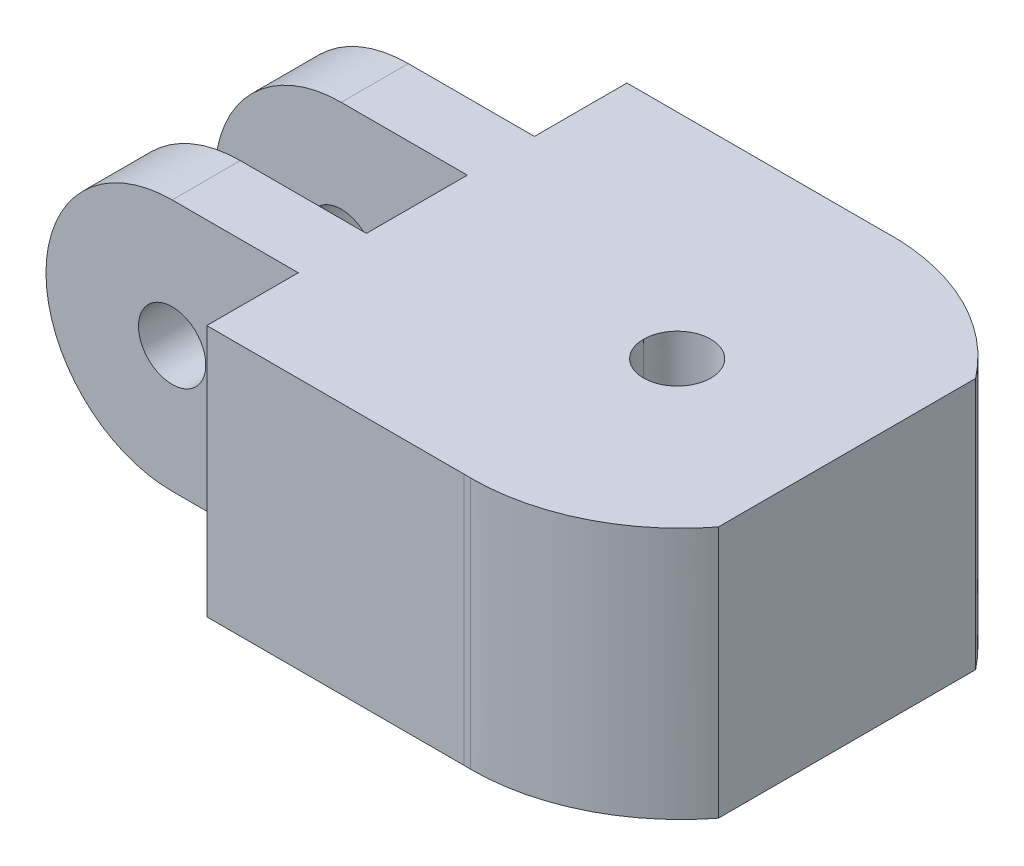
ISO-10303-21;
HEADER;
FILE_DESCRIPTION(('STEP AP214'),'2;1');
FILE_NAME('part.step','',(''),(''),'','','');
FILE_SCHEMA(('AUTOMOTIVE_DESIGN { 1 0 10303 214 1 1 1 1 }'));
ENDSEC;
DATA;
#1=APPLICATION_CONTEXT('core data for automotive mechanical design processes');
#2=APPLICATION_PROTOCOL_DEFINITION('international standard','automotive_design',2000,#1);
#3=PRODUCT_CONTEXT('',#1,'mechanical');
#4=PRODUCT('Part','Part','',(#3));
#5=PRODUCT_RELATED_PRODUCT_CATEGORY('part','',(#4));
#6=PRODUCT_DEFINITION_FORMATION('','',#4);
#7=PRODUCT_DEFINITION_CONTEXT('part definition',#1,'design');
#8=PRODUCT_DEFINITION('design','',#6,#7);
#9=PRODUCT_DEFINITION_SHAPE('','',#8);
#10=(LENGTH_UNIT() NAMED_UNIT(*) SI_UNIT(.MILLI.,.METRE.));
#11=(NAMED_UNIT(*) PLANE_ANGLE_UNIT() SI_UNIT($,.RADIAN.));
#12=(NAMED_UNIT(*) SI_UNIT($,.STERADIAN.) SOLID_ANGLE_UNIT());
#13=UNCERTAINTY_MEASURE_WITH_UNIT(LENGTH_MEASURE(1.E-05),#10,'distance_accuracy_value','');
#14=(GEOMETRIC_REPRESENTATION_CONTEXT(3) GLOBAL_UNCERTAINTY_ASSIGNED_CONTEXT((#13)) GLOBAL_UNIT_ASSIGNED_CONTEXT((#10,
#11,#12)) REPRESENTATION_CONTEXT('',''));
#15=CARTESIAN_POINT('',(0.,0.,0.));
#16=DIRECTION('',(0.,0.,1.));
#17=DIRECTION('',(1.,0.,0.));
#18=AXIS2_PLACEMENT_3D('',#15,#16,#17);
#19=CARTESIAN_POINT('',(39.5244608462387,15.,-21.3286292128754));
#20=DIRECTION('',(0.,-1.,0.));
#21=DIRECTION('',(0.,0.,-1.));
#22=AXIS2_PLACEMENT_3D('',#19,#20,#21);
#23=PLANE('',#22);
#24=CARTESIAN_POINT('',(28.6855875579328,15.,-12.2814208953672));
#25=CARTESIAN_POINT('',(28.6855875579328,15.,-11.1765787732475));
#26=CARTESIAN_POINT('',(29.5813123840978,15.,-10.2811984566311));
#27=CARTESIAN_POINT('',(30.6858099966689,15.,-10.2811984566311));
#28=CARTESIAN_POINT('',(31.79030760924,15.,-10.2811984566311));
#29=CARTESIAN_POINT('',(32.6856879258564,15.,-11.1765787732475));
#30=CARTESIAN_POINT('',(32.6856879258564,15.,-12.2814208953672));
#31=B_SPLINE_CURVE_WITH_KNOTS('',3,(#24,#25,#26,#27,#28,#29,#30),.UNSPECIFIED.,.F.,.F.,(4,3,4),
(0.,1.,2.),.UNSPECIFIED.);
#32=CARTESIAN_POINT('',(28.6855875579328,15.,-12.2814208953672));
#33=VERTEX_POINT('',#32);
#34=CARTESIAN_POINT('',(32.6856879258564,15.,-12.2814208953672));
#35=VERTEX_POINT('',#34);
#36=EDGE_CURVE('E407',#33,#35,#31,.T.);
#37=ORIENTED_EDGE('',*,*,#36,.F.);
#38=CARTESIAN_POINT('',(32.6856879258564,15.,-12.2814208953672));
#39=CARTESIAN_POINT('',(32.6856879258564,15.,-13.3859185079383));
#40=CARTESIAN_POINT('',(31.79030760924,15.,-14.2812988245547));
#41=CARTESIAN_POINT('',(30.6858099966689,15.,-14.2812988245547));
#42=CARTESIAN_POINT('',(29.5813123840978,15.,-14.2812988245547));
#43=CARTESIAN_POINT('',(28.6855875579328,15.,-13.3859185079383));
#44=CARTESIAN_POINT('',(28.6855875579328,15.,-12.2814208953672));
#45=B_SPLINE_CURVE_WITH_KNOTS('',3,(#38,#39,#40,#41,#42,#43,#44),.UNSPECIFIED.,.F.,.F.,(4,3,4),
(2.,3.,4.),.UNSPECIFIED.);
#46=EDGE_CURVE('E413',#35,#33,#45,.T.);
#47=ORIENTED_EDGE('',*,*,#46,.F.);
#48=EDGE_LOOP('',(#37,#47));
#49=FACE_BOUND('',#48,.T.);
#50=CARTESIAN_POINT('',(30.6858099966689,15.,0.00999077690716499));
#51=CARTESIAN_POINT('',(37.5890923300125,15.,0.00999077690716499));
#52=CARTESIAN_POINT('',(43.1856499458008,15.,-5.58622232933262));
#53=CARTESIAN_POINT('',(43.1856499458008,15.,-12.4898491722248));
#54=B_SPLINE_CURVE_WITH_KNOTS('',3,(#50,#51,#52,#53),.UNSPECIFIED.,.F.,.F.,(4,4),(16.,17.),.UNSPECIFIED.);
#55=CARTESIAN_POINT('',(30.6858099966689,15.,0.00999077690716499));
#56=VERTEX_POINT('',#55);
#57=CARTESIAN_POINT('',(40.5766429318879,15.,-4.84574902837719));
#58=VERTEX_POINT('',#57);
#59=EDGE_CURVE('E182',#56,#58,#54,.T.);
#60=ORIENTED_EDGE('',*,*,#59,.T.);
#61=DIRECTION('',(0.,0.,1.));
#62=VECTOR('',#61,1.);
#63=CARTESIAN_POINT('',(40.5766429257683,15.,-31.1783036208755));
#64=LINE('',#63,#62);
#65=CARTESIAN_POINT('',(40.5766429257683,15.,-20.1339493160724));
#66=VERTEX_POINT('',#65);
#67=EDGE_CURVE('E48',#66,#58,#64,.T.);
#68=ORIENTED_EDGE('',*,*,#67,.F.);
#69=CARTESIAN_POINT('',(43.1856499458008,15.,-12.4898491722248));
#70=CARTESIAN_POINT('',(43.1856499458008,15.,-19.3934760151169));
#71=CARTESIAN_POINT('',(37.5890923300125,15.,-24.9896891213568));
#72=CARTESIAN_POINT('',(30.6858099966689,15.,-24.9896891213568));
#73=B_SPLINE_CURVE_WITH_KNOTS('',3,(#69,#70,#71,#72),.UNSPECIFIED.,.F.,.F.,(4,4),(17.,18.),.UNSPECIFIED.);
#74=CARTESIAN_POINT('',(30.6858099966689,15.,-24.9896891213568));
#75=VERTEX_POINT('',#74);
#76=EDGE_CURVE('E179',#66,#75,#73,.T.);
#77=ORIENTED_EDGE('',*,*,#76,.T.);
#78=CARTESIAN_POINT('',(30.6858099966689,15.,-24.9896891213568));
#79=CARTESIAN_POINT('',(30.5528293109382,15.,-24.9896891213568));
#80=CARTESIAN_POINT('',(30.4219156824987,15.,-24.9838324590318));
#81=CARTESIAN_POINT('',(30.2903130349622,15.,-24.9796983444496));
#82=B_SPLINE_CURVE_WITH_KNOTS('',3,(#78,#79,#80,#81),.UNSPECIFIED.,.F.,.F.,(4,4),(0.,1.),.UNSPECIFIED.);
#83=CARTESIAN_POINT('',(30.2903130349622,15.,-24.9796983444496));
#84=VERTEX_POINT('',#83);
#85=EDGE_CURVE('E188',#75,#84,#82,.T.);
#86=ORIENTED_EDGE('',*,*,#85,.T.);
#87=DIRECTION('',(-1.,0.,0.));
#88=VECTOR('',#87,1.);
#89=CARTESIAN_POINT('',(30.2903130349622,15.,-24.9796983444496));
#90=LINE('',#89,#88);
#91=CARTESIAN_POINT('',(14.9999457427778,15.,-24.9796983444496));
#92=VERTEX_POINT('',#91);
#93=EDGE_CURVE('E191',#84,#92,#90,.T.);
#94=ORIENTED_EDGE('',*,*,#93,.T.);
#95=DIRECTION('',(0.,0.,1.));
#96=VECTOR('',#95,1.);
#97=CARTESIAN_POINT('',(14.9999457427778,15.,-24.9796983444496));
#98=LINE('',#97,#96);
#99=CARTESIAN_POINT('',(14.9999457427778,15.,-19.4798312667065));
#100=VERTEX_POINT('',#99);
#101=EDGE_CURVE('E639',#92,#100,#98,.T.);
#102=ORIENTED_EDGE('',*,*,#101,.T.);
#103=DIRECTION('',(1.,0.,0.));
#104=VECTOR('',#103,1.);
#105=CARTESIAN_POINT('',(14.9999457427778,15.,-19.4798312667065));
#106=LINE('',#105,#104);
#107=CARTESIAN_POINT('',(7.5,15.,-19.4798312667065));
#108=VERTEX_POINT('',#107);
#109=EDGE_CURVE('E342',#108,#100,#106,.T.);
#110=ORIENTED_EDGE('',*,*,#109,.F.);
#111=DIRECTION('',(0.,0.,1.));
#112=VECTOR('',#111,1.);
#113=CARTESIAN_POINT('',(7.5,15.,-21.3286292128754));
#114=LINE('',#113,#112);
#115=CARTESIAN_POINT('',(7.5,15.,-15.4900878881275));
#116=VERTEX_POINT('',#115);
#117=EDGE_CURVE('E328',#108,#116,#114,.T.);
#118=ORIENTED_EDGE('',*,*,#117,.T.);
#119=DIRECTION('',(1.,0.,0.));
#120=VECTOR('',#119,1.);
#121=CARTESIAN_POINT('',(14.9999457427778,15.,-15.4900878881275));
#122=LINE('',#121,#120);
#123=CARTESIAN_POINT('',(14.9999457427778,15.,-15.4900878881275));
#124=VERTEX_POINT('',#123);
#125=EDGE_CURVE('E351',#116,#124,#122,.T.);
#126=ORIENTED_EDGE('',*,*,#125,.T.);
#127=DIRECTION('',(0.,0.,1.));
#128=VECTOR('',#127,1.);
#129=CARTESIAN_POINT('',(14.9999457427778,15.,-14.9799641889634));
#130=LINE('',#129,#128);
#131=CARTESIAN_POINT('',(14.9999457427778,15.,-9.49008788812752));
#132=VERTEX_POINT('',#131);
#133=EDGE_CURVE('E366',#124,#132,#130,.T.);
#134=ORIENTED_EDGE('',*,*,#133,.T.);
#135=DIRECTION('',(1.,0.,0.));
#136=VECTOR('',#135,1.);
#137=CARTESIAN_POINT('',(14.9999457427778,15.,-9.49008788812752));
#138=LINE('',#137,#136);
#139=CARTESIAN_POINT('',(7.5,15.,-9.49008788812752));
#140=VERTEX_POINT('',#139);
#141=EDGE_CURVE('E367',#140,#132,#138,.T.);
#142=ORIENTED_EDGE('',*,*,#141,.F.);
#143=DIRECTION('',(0.,0.,1.));
#144=VECTOR('',#143,1.);
#145=CARTESIAN_POINT('',(7.5,15.,-21.3286292128754));
#146=LINE('',#145,#144);
#147=CARTESIAN_POINT('',(7.5,15.,-5.4385443781057));
#148=VERTEX_POINT('',#147);
#149=EDGE_CURVE('E326',#140,#148,#146,.T.);
#150=ORIENTED_EDGE('',*,*,#149,.T.);
#151=DIRECTION('',(-1.,0.,0.));
#152=VECTOR('',#151,1.);
#153=CARTESIAN_POINT('',(14.9999457427778,15.,-5.4385443781057));
#154=LINE('',#153,#152);
#155=CARTESIAN_POINT('',(14.9999457427778,15.,-5.4385443781057));
#156=VERTEX_POINT('',#155);
#157=EDGE_CURVE('E388',#156,#148,#154,.T.);
#158=ORIENTED_EDGE('',*,*,#157,.F.);
#159=DIRECTION('',(0.,0.,1.));
#160=VECTOR('',#159,1.);
#161=CARTESIAN_POINT('',(14.9999457427778,15.,-4.9385443781057));
#162=LINE('',#161,#160);
#163=CARTESIAN_POINT('',(14.9999457427778,15.,0.));
#164=VERTEX_POINT('',#163);
#165=EDGE_CURVE('E644',#156,#164,#162,.T.);
#166=ORIENTED_EDGE('',*,*,#165,.T.);
#167=DIRECTION('',(1.,0.,0.));
#168=VECTOR('',#167,1.);
#169=CARTESIAN_POINT('',(14.9999457427778,15.,0.));
#170=LINE('',#169,#168);
#171=CARTESIAN_POINT('',(30.2903130349622,15.,0.));
#172=VERTEX_POINT('',#171);
#173=EDGE_CURVE('E656',#164,#172,#170,.T.);
#174=ORIENTED_EDGE('',*,*,#173,.T.);
#175=CARTESIAN_POINT('',(30.2903130349622,15.,0.));
#176=CARTESIAN_POINT('',(30.4219156824987,15.,0.00413411458230484));
#177=CARTESIAN_POINT('',(30.5528293109382,15.,0.00999077690716499));
#178=CARTESIAN_POINT('',(30.6858099966689,15.,0.00999077690716499));
#179=B_SPLINE_CURVE_WITH_KNOTS('',3,(#175,#176,#177,#178),.UNSPECIFIED.,.F.,.F.,(4,4),(15.,16.),.UNSPECIFIED.);
#180=EDGE_CURVE('E263',#172,#56,#179,.T.);
#181=ORIENTED_EDGE('',*,*,#180,.T.);
#182=EDGE_LOOP('',(#60,#68,#77,#86,#94,#102,#110,#118,#126,#134,#142,#150,#158,#166,#174,#181));
#183=FACE_BOUND('',#182,.T.);
#184=ADVANCED_FACE('F33',(#49,#183),#23,.F.);
#185=CARTESIAN_POINT('',(39.5244608462387,0.,-21.3286292128754));
#186=DIRECTION('',(0.,-1.,0.));
#187=DIRECTION('',(0.,0.,-1.));
#188=AXIS2_PLACEMENT_3D('',#185,#186,#187);
#189=PLANE('',#188);
#190=DIRECTION('',(0.,0.,1.));
#191=VECTOR('',#190,1.);
#192=CARTESIAN_POINT('',(40.5766429257683,0.,-31.1783036208755));
#193=LINE('',#192,#191);
#194=CARTESIAN_POINT('',(40.5766429257683,0.,-20.1339493160724));
#195=VERTEX_POINT('',#194);
#196=CARTESIAN_POINT('',(40.5766429257683,0.,-4.84574902837719));
#197=VERTEX_POINT('',#196);
#198=EDGE_CURVE('E171',#195,#197,#193,.T.);
#199=ORIENTED_EDGE('',*,*,#198,.T.);
#200=CARTESIAN_POINT('',(30.6858099966689,0.,0.00999077690716499));
#201=CARTESIAN_POINT('',(37.5890923300125,0.,0.00999077690716499));
#202=CARTESIAN_POINT('',(43.1856499458008,0.,-5.58622232933262));
#203=CARTESIAN_POINT('',(43.1856499458008,0.,-12.4898491722248));
#204=B_SPLINE_CURVE_WITH_KNOTS('',3,(#200,#201,#202,#203),.UNSPECIFIED.,.F.,.F.,(4,4),(16.,17.),.UNSPECIFIED.);
#205=CARTESIAN_POINT('',(30.6858099966689,0.,0.00999077690716499));
#206=VERTEX_POINT('',#205);
#207=EDGE_CURVE('E189',#206,#197,#204,.T.);
#208=ORIENTED_EDGE('',*,*,#207,.F.);
#209=CARTESIAN_POINT('',(30.2903130349622,0.,0.));
#210=CARTESIAN_POINT('',(30.4219156824987,0.,0.00413411458230484));
#211=CARTESIAN_POINT('',(30.5528293109382,0.,0.00999077690716499));
#212=CARTESIAN_POINT('',(30.6858099966689,0.,0.00999077690716499));
#213=B_SPLINE_CURVE_WITH_KNOTS('',3,(#209,#210,#211,#212),.UNSPECIFIED.,.F.,.F.,(4,4),(15.,16.),.UNSPECIFIED.);
#214=CARTESIAN_POINT('',(30.2903130349622,0.,0.));
#215=VERTEX_POINT('',#214);
#216=EDGE_CURVE('E194',#215,#206,#213,.T.);
#217=ORIENTED_EDGE('',*,*,#216,.F.);
#218=DIRECTION('',(1.,0.,0.));
#219=VECTOR('',#218,1.);
#220=CARTESIAN_POINT('',(14.9999457427778,0.,0.));
#221=LINE('',#220,#219);
#222=CARTESIAN_POINT('',(14.9999457427778,0.,0.));
#223=VERTEX_POINT('',#222);
#224=EDGE_CURVE('E293',#223,#215,#221,.T.);
#225=ORIENTED_EDGE('',*,*,#224,.F.);
#226=DIRECTION('',(0.,0.,1.));
#227=VECTOR('',#226,1.);
#228=CARTESIAN_POINT('',(14.9999457427778,0.,-4.9385443781057));
#229=LINE('',#228,#227);
#230=CARTESIAN_POINT('',(14.9999457427778,0.,-5.4385443781057));
#231=VERTEX_POINT('',#230);
#232=EDGE_CURVE('E291',#231,#223,#229,.T.);
#233=ORIENTED_EDGE('',*,*,#232,.F.);
#234=DIRECTION('',(1.,0.,0.));
#235=VECTOR('',#234,1.);
#236=CARTESIAN_POINT('',(14.9999457427778,0.,-5.4385443781057));
#237=LINE('',#236,#235);
#238=CARTESIAN_POINT('',(7.5,0.,-5.4385443781057));
#239=VERTEX_POINT('',#238);
#240=EDGE_CURVE('E347',#239,#231,#237,.T.);
#241=ORIENTED_EDGE('',*,*,#240,.F.);
#242=DIRECTION('',(0.,0.,1.));
#243=VECTOR('',#242,1.);
#244=CARTESIAN_POINT('',(7.5,0.,-9.93841145584881));
#245=LINE('',#244,#243);
#246=CARTESIAN_POINT('',(7.5,0.,-9.49008788812752));
#247=VERTEX_POINT('',#246);
#248=EDGE_CURVE('E323',#239,#247,#245,.F.);
#249=ORIENTED_EDGE('',*,*,#248,.T.);
#250=DIRECTION('',(1.,0.,0.));
#251=VECTOR('',#250,1.);
#252=CARTESIAN_POINT('',(39.5244608462387,0.,-9.49008788812752));
#253=LINE('',#252,#251);
#254=CARTESIAN_POINT('',(14.9999457427778,0.,-9.49008788812752));
#255=VERTEX_POINT('',#254);
#256=EDGE_CURVE('E55',#247,#255,#253,.T.);
#257=ORIENTED_EDGE('',*,*,#256,.T.);
#258=DIRECTION('',(0.,0.,1.));
#259=VECTOR('',#258,1.);
#260=CARTESIAN_POINT('',(14.9999457427778,0.,-14.9799641889634));
#261=LINE('',#260,#259);
#262=CARTESIAN_POINT('',(14.9999457427778,0.,-15.4900878881275));
#263=VERTEX_POINT('',#262);
#264=EDGE_CURVE('E289',#263,#255,#261,.T.);
#265=ORIENTED_EDGE('',*,*,#264,.F.);
#266=DIRECTION('',(1.,0.,0.));
#267=VECTOR('',#266,1.);
#268=CARTESIAN_POINT('',(39.5244608462387,0.,-15.4900878881275));
#269=LINE('',#268,#267);
#270=CARTESIAN_POINT('',(7.5,0.,-15.4900878881275));
#271=VERTEX_POINT('',#270);
#272=EDGE_CURVE('E41',#271,#263,#269,.T.);
#273=ORIENTED_EDGE('',*,*,#272,.F.);
#274=DIRECTION('',(0.,0.,1.));
#275=VECTOR('',#274,1.);
#276=CARTESIAN_POINT('',(7.5,0.,-19.9798312667065));
#277=LINE('',#276,#275);
#278=CARTESIAN_POINT('',(7.5,0.,-19.4798312667065));
#279=VERTEX_POINT('',#278);
#280=EDGE_CURVE('E321',#271,#279,#277,.F.);
#281=ORIENTED_EDGE('',*,*,#280,.T.);
#282=DIRECTION('',(-1.,0.,0.));
#283=VECTOR('',#282,1.);
#284=CARTESIAN_POINT('',(14.9999457427778,0.,-19.4798312667065));
#285=LINE('',#284,#283);
#286=CARTESIAN_POINT('',(14.9999457427778,0.,-19.4798312667065));
#287=VERTEX_POINT('',#286);
#288=EDGE_CURVE('E399',#287,#279,#285,.T.);
#289=ORIENTED_EDGE('',*,*,#288,.F.);
#290=DIRECTION('',(0.,0.,1.));
#291=VECTOR('',#290,1.);
#292=CARTESIAN_POINT('',(14.9999457427778,0.,-24.9796983444496));
#293=LINE('',#292,#291);
#294=CARTESIAN_POINT('',(14.9999457427778,0.,-24.9796983444496));
#295=VERTEX_POINT('',#294);
#296=EDGE_CURVE('E287',#295,#287,#293,.T.);
#297=ORIENTED_EDGE('',*,*,#296,.F.);
#298=DIRECTION('',(-1.,0.,0.));
#299=VECTOR('',#298,1.);
#300=CARTESIAN_POINT('',(30.2903130349622,0.,-24.9796983444496));
#301=LINE('',#300,#299);
#302=CARTESIAN_POINT('',(30.2903130349622,0.,-24.9796983444496));
#303=VERTEX_POINT('',#302);
#304=EDGE_CURVE('E282',#303,#295,#301,.T.);
#305=ORIENTED_EDGE('',*,*,#304,.F.);
#306=CARTESIAN_POINT('',(30.6858099966689,0.,-24.9896891213568));
#307=CARTESIAN_POINT('',(30.5528293109382,0.,-24.9896891213568));
#308=CARTESIAN_POINT('',(30.4219156824987,0.,-24.9838324590318));
#309=CARTESIAN_POINT('',(30.2903130349622,0.,-24.9796983444496));
#310=B_SPLINE_CURVE_WITH_KNOTS('',3,(#306,#307,#308,#309),.UNSPECIFIED.,.F.,.F.,(4,4),(0.,1.),.UNSPECIFIED.);
#311=CARTESIAN_POINT('',(30.6858099966689,0.,-24.9896891213568));
#312=VERTEX_POINT('',#311);
#313=EDGE_CURVE('E275',#312,#303,#310,.T.);
#314=ORIENTED_EDGE('',*,*,#313,.F.);
#315=CARTESIAN_POINT('',(43.1856499458008,0.,-12.4898491722248));
#316=CARTESIAN_POINT('',(43.1856499458008,0.,-19.3934760151169));
#317=CARTESIAN_POINT('',(37.5890923300125,0.,-24.9896891213568));
#318=CARTESIAN_POINT('',(30.6858099966689,0.,-24.9896891213568));
#319=B_SPLINE_CURVE_WITH_KNOTS('',3,(#315,#316,#317,#318),.UNSPECIFIED.,.F.,.F.,(4,4),(17.,18.),.UNSPECIFIED.);
#320=EDGE_CURVE('E268',#195,#312,#319,.T.);
#321=ORIENTED_EDGE('',*,*,#320,.F.);
#322=EDGE_LOOP('',(#199,#208,#217,#225,#233,#241,#249,#257,#265,#273,#281,#289,#297,#305,#314,#321));
#323=FACE_BOUND('',#322,.T.);
#324=CARTESIAN_POINT('',(32.6856879258564,0.,-12.2814208953672));
#325=CARTESIAN_POINT('',(32.6856879258564,0.,-13.3859185079383));
#326=CARTESIAN_POINT('',(31.79030760924,0.,-14.2812988245547));
#327=CARTESIAN_POINT('',(30.6858099966689,0.,-14.2812988245547));
#328=CARTESIAN_POINT('',(29.5813123840978,0.,-14.2812988245547));
#329=CARTESIAN_POINT('',(28.6855875579328,0.,-13.3859185079383));
#330=CARTESIAN_POINT('',(28.6855875579328,0.,-12.2814208953672));
#331=B_SPLINE_CURVE_WITH_KNOTS('',3,(#324,#325,#326,#327,#328,#329,#330),.UNSPECIFIED.,.F.,.F.,
(4,3,4),(2.,3.,4.),.UNSPECIFIED.);
#332=CARTESIAN_POINT('',(32.6856879258564,0.,-12.2814208953672));
#333=VERTEX_POINT('',#332);
#334=CARTESIAN_POINT('',(28.6855875579328,0.,-12.2814208953672));
#335=VERTEX_POINT('',#334);
#336=EDGE_CURVE('E414',#333,#335,#331,.T.);
#337=ORIENTED_EDGE('',*,*,#336,.T.);
#338=CARTESIAN_POINT('',(28.6855875579328,0.,-12.2814208953672));
#339=CARTESIAN_POINT('',(28.6855875579328,0.,-11.1765787732475));
#340=CARTESIAN_POINT('',(29.5813123840978,0.,-10.2811984566311));
#341=CARTESIAN_POINT('',(30.6858099966689,0.,-10.2811984566311));
#342=CARTESIAN_POINT('',(31.79030760924,0.,-10.2811984566311));
#343=CARTESIAN_POINT('',(32.6856879258564,0.,-11.1765787732475));
#344=CARTESIAN_POINT('',(32.6856879258564,0.,-12.2814208953672));
#345=B_SPLINE_CURVE_WITH_KNOTS('',3,(#338,#339,#340,#341,#342,#343,#344),.UNSPECIFIED.,.F.,.F.,
(4,3,4),(0.,1.,2.),.UNSPECIFIED.);
#346=EDGE_CURVE('E334',#335,#333,#345,.T.);
#347=ORIENTED_EDGE('',*,*,#346,.T.);
#348=EDGE_LOOP('',(#337,#347));
#349=FACE_BOUND('',#348,.T.);
#350=ADVANCED_FACE('F223',(#323,#349),#189,.T.);
#351=CARTESIAN_POINT('',(7.5,7.5,-21.3286292128754));
#352=DIRECTION('',(0.,0.,1.));
#353=DIRECTION('',(1.,0.,0.));
#354=AXIS2_PLACEMENT_3D('',#351,#352,#353);
#355=CYLINDRICAL_SURFACE('',#354,7.5);
#356=ORIENTED_EDGE('',*,*,#149,.F.);
#357=CARTESIAN_POINT('',(7.5,7.5,-9.49008788812752));
#358=DIRECTION('',(0.,0.,-1.));
#359=DIRECTION('',(-1.,0.,0.));
#360=AXIS2_PLACEMENT_3D('',#357,#358,#359);
#361=CIRCLE('',#360,7.5);
#362=CARTESIAN_POINT('',(0.,7.5,-9.49008788812752));
#363=VERTEX_POINT('',#362);
#364=EDGE_CURVE('E375',#140,#363,#361,.F.);
#365=ORIENTED_EDGE('',*,*,#364,.T.);
#366=DIRECTION('',(0.,0.,1.));
#367=VECTOR('',#366,1.);
#368=CARTESIAN_POINT('',(0.,7.5,-9.93841145584881));
#369=LINE('',#368,#367);
#370=CARTESIAN_POINT('',(0.,7.5,-5.4385443781057));
#371=VERTEX_POINT('',#370);
#372=EDGE_CURVE('E331',#371,#363,#369,.F.);
#373=ORIENTED_EDGE('',*,*,#372,.F.);
#374=CARTESIAN_POINT('',(7.5,7.5,-5.4385443781057));
#375=DIRECTION('',(0.,0.,-1.));
#376=DIRECTION('',(-1.,0.,0.));
#377=AXIS2_PLACEMENT_3D('',#374,#375,#376);
#378=CIRCLE('',#377,7.5);
#379=EDGE_CURVE('E394',#148,#371,#378,.F.);
#380=ORIENTED_EDGE('',*,*,#379,.F.);
#381=EDGE_LOOP('',(#356,#365,#373,#380));
#382=FACE_BOUND('',#381,.T.);
#383=ADVANCED_FACE('F220',(#382),#355,.T.);
#384=CARTESIAN_POINT('',(7.5,7.5,-9.93841145584881));
#385=DIRECTION('',(0.,0.,-1.));
#386=DIRECTION('',(-1.,0.,0.));
#387=AXIS2_PLACEMENT_3D('',#384,#385,#386);
#388=CYLINDRICAL_SURFACE('',#387,7.5);
#389=ORIENTED_EDGE('',*,*,#372,.T.);
#390=CARTESIAN_POINT('',(7.5,7.5,-9.49008788812752));
#391=DIRECTION('',(0.,0.,-1.));
#392=DIRECTION('',(-1.,0.,0.));
#393=AXIS2_PLACEMENT_3D('',#390,#391,#392);
#394=CIRCLE('',#393,7.5);
#395=EDGE_CURVE('E350',#363,#247,#394,.F.);
#396=ORIENTED_EDGE('',*,*,#395,.T.);
#397=ORIENTED_EDGE('',*,*,#248,.F.);
#398=CARTESIAN_POINT('',(7.5,7.5,-5.4385443781057));
#399=DIRECTION('',(0.,0.,-1.));
#400=DIRECTION('',(-1.,0.,0.));
#401=AXIS2_PLACEMENT_3D('',#398,#399,#400);
#402=CIRCLE('',#401,7.5);
#403=EDGE_CURVE('E346',#371,#239,#402,.F.);
#404=ORIENTED_EDGE('',*,*,#403,.F.);
#405=EDGE_LOOP('',(#389,#396,#397,#404));
#406=FACE_BOUND('',#405,.T.);
#407=ADVANCED_FACE('F216',(#406),#388,.T.);
#408=CARTESIAN_POINT('',(7.5,7.5,0.00999077690716499));
#409=DIRECTION('',(0.,0.,-1.));
#410=DIRECTION('',(-1.,0.,0.));
#411=AXIS2_PLACEMENT_3D('',#408,#409,#410);
#412=CYLINDRICAL_SURFACE('',#411,2.);
#413=CARTESIAN_POINT('',(7.5,7.5,-5.4385443781057));
#414=DIRECTION('',(0.,0.,-1.));
#415=DIRECTION('',(-1.,0.,0.));
#416=AXIS2_PLACEMENT_3D('',#413,#414,#415);
#417=CIRCLE('',#416,2.);
#418=CARTESIAN_POINT('',(5.5,7.5,-5.4385443781057));
#419=VERTEX_POINT('',#418);
#420=EDGE_CURVE('E343',#419,#419,#417,.F.);
#421=ORIENTED_EDGE('',*,*,#420,.T.);
#422=EDGE_LOOP('',(#421));
#423=FACE_BOUND('',#422,.T.);
#424=CARTESIAN_POINT('',(7.5,7.5,-9.49008788812752));
#425=DIRECTION('',(0.,0.,-1.));
#426=DIRECTION('',(-1.,0.,0.));
#427=AXIS2_PLACEMENT_3D('',#424,#425,#426);
#428=CIRCLE('',#427,2.);
#429=CARTESIAN_POINT('',(5.5,7.5,-9.49008788812752));
#430=VERTEX_POINT('',#429);
#431=EDGE_CURVE('E348',#430,#430,#428,.F.);
#432=ORIENTED_EDGE('',*,*,#431,.F.);
#433=EDGE_LOOP('',(#432));
#434=FACE_BOUND('',#433,.T.);
#435=ADVANCED_FACE('F219',(#423,#434),#412,.F.);
#436=CARTESIAN_POINT('',(7.5,7.5,-21.3286292128754));
#437=DIRECTION('',(0.,0.,1.));
#438=DIRECTION('',(1.,0.,0.));
#439=AXIS2_PLACEMENT_3D('',#436,#437,#438);
#440=CYLINDRICAL_SURFACE('',#439,7.5);
#441=CARTESIAN_POINT('',(7.5,7.5,-15.4900878881275));
#442=DIRECTION('',(0.,0.,-1.));
#443=DIRECTION('',(-1.,0.,0.));
#444=AXIS2_PLACEMENT_3D('',#441,#442,#443);
#445=CIRCLE('',#444,7.5);
#446=CARTESIAN_POINT('',(0.,7.5,-15.4900878881275));
#447=VERTEX_POINT('',#446);
#448=EDGE_CURVE('E380',#116,#447,#445,.F.);
#449=ORIENTED_EDGE('',*,*,#448,.F.);
#450=ORIENTED_EDGE('',*,*,#117,.F.);
#451=CARTESIAN_POINT('',(7.5,7.5,-19.4798312667065));
#452=DIRECTION('',(0.,0.,-1.));
#453=DIRECTION('',(-1.,0.,0.));
#454=AXIS2_PLACEMENT_3D('',#451,#452,#453);
#455=CIRCLE('',#454,7.5);
#456=CARTESIAN_POINT('',(0.,7.5,-19.4798312667065));
#457=VERTEX_POINT('',#456);
#458=EDGE_CURVE('E337',#108,#457,#455,.F.);
#459=ORIENTED_EDGE('',*,*,#458,.T.);
#460=DIRECTION('',(0.,0.,1.));
#461=VECTOR('',#460,1.);
#462=CARTESIAN_POINT('',(0.,7.5,-19.9798312667065));
#463=LINE('',#462,#461);
#464=EDGE_CURVE('E335',#447,#457,#463,.F.);
#465=ORIENTED_EDGE('',*,*,#464,.F.);
#466=EDGE_LOOP('',(#449,#450,#459,#465));
#467=FACE_BOUND('',#466,.T.);
#468=ADVANCED_FACE('F35',(#467),#440,.T.);
#469=CARTESIAN_POINT('',(7.5,7.5,-19.9798312667065));
#470=DIRECTION('',(0.,0.,-1.));
#471=DIRECTION('',(-1.,0.,0.));
#472=AXIS2_PLACEMENT_3D('',#469,#470,#471);
#473=CYLINDRICAL_SURFACE('',#472,7.5);
#474=CARTESIAN_POINT('',(7.5,7.5,-15.4900878881275));
#475=DIRECTION('',(0.,0.,-1.));
#476=DIRECTION('',(-1.,0.,0.));
#477=AXIS2_PLACEMENT_3D('',#474,#475,#476);
#478=CIRCLE('',#477,7.5);
#479=EDGE_CURVE('E361',#447,#271,#478,.F.);
#480=ORIENTED_EDGE('',*,*,#479,.F.);
#481=ORIENTED_EDGE('',*,*,#464,.T.);
#482=CARTESIAN_POINT('',(7.5,7.5,-19.4798312667065));
#483=DIRECTION('',(0.,0.,-1.));
#484=DIRECTION('',(-1.,0.,0.));
#485=AXIS2_PLACEMENT_3D('',#482,#483,#484);
#486=CIRCLE('',#485,7.5);
#487=EDGE_CURVE('E341',#457,#279,#486,.F.);
#488=ORIENTED_EDGE('',*,*,#487,.T.);
#489=ORIENTED_EDGE('',*,*,#280,.F.);
#490=EDGE_LOOP('',(#480,#481,#488,#489));
#491=FACE_BOUND('',#490,.T.);
#492=ADVANCED_FACE('F225',(#491),#473,.T.);
#493=CARTESIAN_POINT('',(7.5,7.5,-15.4900878881275));
#494=DIRECTION('',(0.,0.,-1.));
#495=DIRECTION('',(-1.,0.,0.));
#496=AXIS2_PLACEMENT_3D('',#493,#494,#495);
#497=CIRCLE('',#496,2.);
#498=CARTESIAN_POINT('',(5.5,7.5,-15.4900878881275));
#499=VERTEX_POINT('',#498);
#500=EDGE_CURVE('E382',#499,#499,#497,.F.);
#501=ORIENTED_EDGE('',*,*,#500,.T.);
#502=EDGE_LOOP('',(#501));
#503=FACE_BOUND('',#502,.T.);
#504=CARTESIAN_POINT('',(7.5,7.5,-19.4798312667065));
#505=DIRECTION('',(0.,0.,-1.));
#506=DIRECTION('',(-1.,0.,0.));
#507=AXIS2_PLACEMENT_3D('',#504,#505,#506);
#508=CIRCLE('',#507,2.);
#509=CARTESIAN_POINT('',(5.5,7.5,-19.4798312667065));
#510=VERTEX_POINT('',#509);
#511=EDGE_CURVE('E338',#510,#510,#508,.F.);
#512=ORIENTED_EDGE('',*,*,#511,.F.);
#513=EDGE_LOOP('',(#512));
#514=FACE_BOUND('',#513,.T.);
#515=ADVANCED_FACE('F214',(#503,#514),#412,.F.);
#516=DIRECTION('',(0.,-1.,0.));
#517=VECTOR('',#516,1.);
#518=SURFACE_OF_LINEAR_EXTRUSION('',#73,#517);
#519=ORIENTED_EDGE('',*,*,#76,.F.);
#520=DIRECTION('',(0.,-1.,0.));
#521=VECTOR('',#520,1.);
#522=CARTESIAN_POINT('',(40.5766429257683,15.,-20.1339493239791));
#523=LINE('',#522,#521);
#524=EDGE_CURVE('E168',#66,#195,#523,.T.);
#525=ORIENTED_EDGE('',*,*,#524,.T.);
#526=ORIENTED_EDGE('',*,*,#320,.T.);
#527=DIRECTION('',(0.,-1.,0.));
#528=VECTOR('',#527,1.);
#529=CARTESIAN_POINT('',(30.6858099966689,15.,-24.9896891213568));
#530=LINE('',#529,#528);
#531=EDGE_CURVE('E187',#75,#312,#530,.T.);
#532=ORIENTED_EDGE('',*,*,#531,.F.);
#533=EDGE_LOOP('',(#519,#525,#526,#532));
#534=FACE_BOUND('',#533,.T.);
#535=ADVANCED_FACE('F185',(#534),#518,.F.);
#536=DIRECTION('',(0.,-1.,0.));
#537=VECTOR('',#536,1.);
#538=SURFACE_OF_LINEAR_EXTRUSION('',#82,#537);
#539=ORIENTED_EDGE('',*,*,#313,.T.);
#540=DIRECTION('',(0.,-1.,0.));
#541=VECTOR('',#540,1.);
#542=CARTESIAN_POINT('',(30.2903130349622,15.,-24.9796983444496));
#543=LINE('',#542,#541);
#544=EDGE_CURVE('E317',#84,#303,#543,.T.);
#545=ORIENTED_EDGE('',*,*,#544,.F.);
#546=ORIENTED_EDGE('',*,*,#85,.F.);
#547=ORIENTED_EDGE('',*,*,#531,.T.);
#548=EDGE_LOOP('',(#539,#545,#546,#547));
#549=FACE_BOUND('',#548,.T.);
#550=ADVANCED_FACE('F213',(#549),#538,.F.);
#551=CARTESIAN_POINT('',(30.2903130349622,15.,-24.9796983444496));
#552=DIRECTION('',(0.,0.,1.));
#553=DIRECTION('',(1.,0.,0.));
#554=AXIS2_PLACEMENT_3D('',#551,#552,#553);
#555=PLANE('',#554);
#556=ORIENTED_EDGE('',*,*,#304,.T.);
#557=DIRECTION('',(0.,-1.,0.));
#558=VECTOR('',#557,1.);
#559=CARTESIAN_POINT('',(14.9999457427778,15.,-24.9796983444496));
#560=LINE('',#559,#558);
#561=EDGE_CURVE('E314',#92,#295,#560,.T.);
#562=ORIENTED_EDGE('',*,*,#561,.F.);
#563=ORIENTED_EDGE('',*,*,#93,.F.);
#564=ORIENTED_EDGE('',*,*,#544,.T.);
#565=EDGE_LOOP('',(#556,#562,#563,#564));
#566=FACE_BOUND('',#565,.T.);
#567=ADVANCED_FACE('F517',(#566),#555,.F.);
#568=CARTESIAN_POINT('',(14.9999457427778,15.,-24.9796983444496));
#569=DIRECTION('',(1.,0.,0.));
#570=DIRECTION('',(0.,0.,-1.));
#571=AXIS2_PLACEMENT_3D('',#568,#569,#570);
#572=PLANE('',#571);
#573=ORIENTED_EDGE('',*,*,#296,.T.);
#574=DIRECTION('',(0.,-1.,0.));
#575=VECTOR('',#574,1.);
#576=CARTESIAN_POINT('',(14.9999457427778,15.,-19.4798312667065));
#577=LINE('',#576,#575);
#578=EDGE_CURVE('E396',#100,#287,#577,.T.);
#579=ORIENTED_EDGE('',*,*,#578,.F.);
#580=ORIENTED_EDGE('',*,*,#101,.F.);
#581=ORIENTED_EDGE('',*,*,#561,.T.);
#582=EDGE_LOOP('',(#573,#579,#580,#581));
#583=FACE_BOUND('',#582,.T.);
#584=ADVANCED_FACE('F510',(#583),#572,.F.);
#585=CARTESIAN_POINT('',(14.9999457427778,15.,-14.9799641889634));
#586=DIRECTION('',(1.,0.,0.));
#587=DIRECTION('',(0.,0.,-1.));
#588=AXIS2_PLACEMENT_3D('',#585,#586,#587);
#589=PLANE('',#588);
#590=ORIENTED_EDGE('',*,*,#264,.T.);
#591=DIRECTION('',(0.,-1.,0.));
#592=VECTOR('',#591,1.);
#593=CARTESIAN_POINT('',(14.9999457427778,15.,-9.49008788812752));
#594=LINE('',#593,#592);
#595=EDGE_CURVE('E175',#132,#255,#594,.T.);
#596=ORIENTED_EDGE('',*,*,#595,.F.);
#597=ORIENTED_EDGE('',*,*,#133,.F.);
#598=DIRECTION('',(0.,-1.,0.));
#599=VECTOR('',#598,1.);
#600=CARTESIAN_POINT('',(14.9999457427778,15.,-15.4900878881275));
#601=LINE('',#600,#599);
#602=EDGE_CURVE('E359',#124,#263,#601,.T.);
#603=ORIENTED_EDGE('',*,*,#602,.T.);
#604=EDGE_LOOP('',(#590,#596,#597,#603));
#605=FACE_BOUND('',#604,.T.);
#606=ADVANCED_FACE('F364',(#605),#589,.F.);
#607=CARTESIAN_POINT('',(14.9999457427778,15.,-4.9385443781057));
#608=DIRECTION('',(1.,0.,0.));
#609=DIRECTION('',(0.,0.,-1.));
#610=AXIS2_PLACEMENT_3D('',#607,#608,#609);
#611=PLANE('',#610);
#612=ORIENTED_EDGE('',*,*,#232,.T.);
#613=DIRECTION('',(0.,-1.,0.));
#614=VECTOR('',#613,1.);
#615=CARTESIAN_POINT('',(14.9999457427778,15.,0.));
#616=LINE('',#615,#614);
#617=EDGE_CURVE('E311',#164,#223,#616,.T.);
#618=ORIENTED_EDGE('',*,*,#617,.F.);
#619=ORIENTED_EDGE('',*,*,#165,.F.);
#620=DIRECTION('',(0.,1.,0.));
#621=VECTOR('',#620,1.);
#622=CARTESIAN_POINT('',(14.9999457427778,15.,-5.4385443781057));
#623=LINE('',#622,#621);
#624=EDGE_CURVE('E385',#231,#156,#623,.T.);
#625=ORIENTED_EDGE('',*,*,#624,.F.);
#626=EDGE_LOOP('',(#612,#618,#619,#625));
#627=FACE_BOUND('',#626,.T.);
#628=ADVANCED_FACE('F497',(#627),#611,.F.);
#629=CARTESIAN_POINT('',(14.9999457427778,15.,0.));
#630=DIRECTION('',(0.,0.,-1.));
#631=DIRECTION('',(-1.,0.,0.));
#632=AXIS2_PLACEMENT_3D('',#629,#630,#631);
#633=PLANE('',#632);
#634=ORIENTED_EDGE('',*,*,#224,.T.);
#635=DIRECTION('',(0.,-1.,0.));
#636=VECTOR('',#635,1.);
#637=CARTESIAN_POINT('',(30.2903130349622,15.,0.));
#638=LINE('',#637,#636);
#639=EDGE_CURVE('E308',#172,#215,#638,.T.);
#640=ORIENTED_EDGE('',*,*,#639,.F.);
#641=ORIENTED_EDGE('',*,*,#173,.F.);
#642=ORIENTED_EDGE('',*,*,#617,.T.);
#643=EDGE_LOOP('',(#634,#640,#641,#642));
#644=FACE_BOUND('',#643,.T.);
#645=ADVANCED_FACE('F490',(#644),#633,.F.);
#646=DIRECTION('',(0.,-1.,0.));
#647=VECTOR('',#646,1.);
#648=SURFACE_OF_LINEAR_EXTRUSION('',#179,#647);
#649=ORIENTED_EDGE('',*,*,#216,.T.);
#650=DIRECTION('',(0.,-1.,0.));
#651=VECTOR('',#650,1.);
#652=CARTESIAN_POINT('',(30.6858099966689,15.,0.00999077690716499));
#653=LINE('',#652,#651);
#654=EDGE_CURVE('E262',#56,#206,#653,.T.);
#655=ORIENTED_EDGE('',*,*,#654,.F.);
#656=ORIENTED_EDGE('',*,*,#180,.F.);
#657=ORIENTED_EDGE('',*,*,#639,.T.);
#658=EDGE_LOOP('',(#649,#655,#656,#657));
#659=FACE_BOUND('',#658,.T.);
#660=ADVANCED_FACE('F254',(#659),#648,.F.);
#661=DIRECTION('',(0.,-1.,0.));
#662=VECTOR('',#661,1.);
#663=SURFACE_OF_LINEAR_EXTRUSION('',#54,#662);
#664=ORIENTED_EDGE('',*,*,#207,.T.);
#665=DIRECTION('',(0.,-1.,0.));
#666=VECTOR('',#665,1.);
#667=CARTESIAN_POINT('',(40.5766429257683,15.,-4.84574902047054));
#668=LINE('',#667,#666);
#669=EDGE_CURVE('E11',#197,#58,#668,.F.);
#670=ORIENTED_EDGE('',*,*,#669,.T.);
#671=ORIENTED_EDGE('',*,*,#59,.F.);
#672=ORIENTED_EDGE('',*,*,#654,.T.);
#673=EDGE_LOOP('',(#664,#670,#671,#672));
#674=FACE_BOUND('',#673,.T.);
#675=ADVANCED_FACE('F250',(#674),#663,.F.);
#676=DIRECTION('',(0.,-1.,0.));
#677=VECTOR('',#676,1.);
#678=SURFACE_OF_LINEAR_EXTRUSION('',#31,#677);
#679=ORIENTED_EDGE('',*,*,#346,.F.);
#680=DIRECTION('',(0.,-1.,0.));
#681=VECTOR('',#680,1.);
#682=CARTESIAN_POINT('',(28.6855875579328,15.,-12.2814208953672));
#683=LINE('',#682,#681);
#684=EDGE_CURVE('E422',#33,#335,#683,.T.);
#685=ORIENTED_EDGE('',*,*,#684,.F.);
#686=ORIENTED_EDGE('',*,*,#36,.T.);
#687=DIRECTION('',(0.,-1.,0.));
#688=VECTOR('',#687,1.);
#689=CARTESIAN_POINT('',(32.6856879258564,15.,-12.2814208953672));
#690=LINE('',#689,#688);
#691=EDGE_CURVE('E200',#35,#333,#690,.T.);
#692=ORIENTED_EDGE('',*,*,#691,.T.);
#693=EDGE_LOOP('',(#679,#685,#686,#692));
#694=FACE_BOUND('',#693,.T.);
#695=ADVANCED_FACE('F246',(#694),#678,.T.);
#696=DIRECTION('',(0.,-1.,0.));
#697=VECTOR('',#696,1.);
#698=SURFACE_OF_LINEAR_EXTRUSION('',#45,#697);
#699=ORIENTED_EDGE('',*,*,#336,.F.);
#700=ORIENTED_EDGE('',*,*,#691,.F.);
#701=ORIENTED_EDGE('',*,*,#46,.T.);
#702=ORIENTED_EDGE('',*,*,#684,.T.);
#703=EDGE_LOOP('',(#699,#700,#701,#702));
#704=FACE_BOUND('',#703,.T.);
#705=ADVANCED_FACE('F429',(#704),#698,.T.);
#706=CARTESIAN_POINT('',(0.,0.,-19.4798312667065));
#707=DIRECTION('',(0.,0.,-1.));
#708=DIRECTION('',(-1.,0.,0.));
#709=AXIS2_PLACEMENT_3D('',#706,#707,#708);
#710=PLANE('',#709);
#711=ORIENTED_EDGE('',*,*,#109,.T.);
#712=ORIENTED_EDGE('',*,*,#578,.T.);
#713=ORIENTED_EDGE('',*,*,#288,.T.);
#714=ORIENTED_EDGE('',*,*,#487,.F.);
#715=ORIENTED_EDGE('',*,*,#458,.F.);
#716=EDGE_LOOP('',(#711,#712,#713,#714,#715));
#717=FACE_BOUND('',#716,.T.);
#718=ORIENTED_EDGE('',*,*,#511,.T.);
#719=EDGE_LOOP('',(#718));
#720=FACE_BOUND('',#719,.T.);
#721=ADVANCED_FACE('F431',(#717,#720),#710,.T.);
#722=CARTESIAN_POINT('',(0.,0.,-5.4385443781057));
#723=DIRECTION('',(0.,0.,-1.));
#724=DIRECTION('',(-1.,0.,0.));
#725=AXIS2_PLACEMENT_3D('',#722,#723,#724);
#726=PLANE('',#725);
#727=ORIENTED_EDGE('',*,*,#379,.T.);
#728=ORIENTED_EDGE('',*,*,#403,.T.);
#729=ORIENTED_EDGE('',*,*,#240,.T.);
#730=ORIENTED_EDGE('',*,*,#624,.T.);
#731=ORIENTED_EDGE('',*,*,#157,.T.);
#732=EDGE_LOOP('',(#727,#728,#729,#730,#731));
#733=FACE_BOUND('',#732,.T.);
#734=ORIENTED_EDGE('',*,*,#420,.F.);
#735=EDGE_LOOP('',(#734));
#736=FACE_BOUND('',#735,.T.);
#737=ADVANCED_FACE('F436',(#733,#736),#726,.F.);
#738=CARTESIAN_POINT('',(0.,0.,-9.49008788812752));
#739=DIRECTION('',(0.,0.,-1.));
#740=DIRECTION('',(-1.,0.,0.));
#741=AXIS2_PLACEMENT_3D('',#738,#739,#740);
#742=PLANE('',#741);
#743=ORIENTED_EDGE('',*,*,#395,.F.);
#744=ORIENTED_EDGE('',*,*,#364,.F.);
#745=ORIENTED_EDGE('',*,*,#141,.T.);
#746=ORIENTED_EDGE('',*,*,#595,.T.);
#747=ORIENTED_EDGE('',*,*,#256,.F.);
#748=EDGE_LOOP('',(#743,#744,#745,#746,#747));
#749=FACE_BOUND('',#748,.T.);
#750=ORIENTED_EDGE('',*,*,#431,.T.);
#751=EDGE_LOOP('',(#750));
#752=FACE_BOUND('',#751,.T.);
#753=ADVANCED_FACE('F440',(#749,#752),#742,.T.);
#754=CARTESIAN_POINT('',(0.,0.,-15.4900878881275));
#755=DIRECTION('',(0.,0.,-1.));
#756=DIRECTION('',(-1.,0.,0.));
#757=AXIS2_PLACEMENT_3D('',#754,#755,#756);
#758=PLANE('',#757);
#759=ORIENTED_EDGE('',*,*,#448,.T.);
#760=ORIENTED_EDGE('',*,*,#479,.T.);
#761=ORIENTED_EDGE('',*,*,#272,.T.);
#762=ORIENTED_EDGE('',*,*,#602,.F.);
#763=ORIENTED_EDGE('',*,*,#125,.F.);
#764=EDGE_LOOP('',(#759,#760,#761,#762,#763));
#765=FACE_BOUND('',#764,.T.);
#766=ORIENTED_EDGE('',*,*,#500,.F.);
#767=EDGE_LOOP('',(#766));
#768=FACE_BOUND('',#767,.T.);
#769=ADVANCED_FACE('F357',(#765,#768),#758,.F.);
#770=CARTESIAN_POINT('',(40.5766429257683,0.,-31.1783036208755));
#771=DIRECTION('',(-1.,0.,0.));
#772=DIRECTION('',(0.,0.,1.));
#773=AXIS2_PLACEMENT_3D('',#770,#771,#772);
#774=PLANE('',#773);
#775=ORIENTED_EDGE('',*,*,#67,.T.);
#776=ORIENTED_EDGE('',*,*,#669,.F.);
#777=ORIENTED_EDGE('',*,*,#198,.F.);
#778=ORIENTED_EDGE('',*,*,#524,.F.);
#779=EDGE_LOOP('',(#775,#776,#777,#778));
#780=FACE_BOUND('',#779,.T.);
#781=ADVANCED_FACE('F169',(#780),#774,.F.);
#782=CLOSED_SHELL('',(#184,#350,#383,#407,#435,#468,#492,#515,#535,#550,#567,#584,#606,#628,
#645,#660,#675,#695,#705,#721,#737,#753,#769,#781));
#783=MANIFOLD_SOLID_BREP('B2',#782);
#784=ADVANCED_BREP_SHAPE_REPRESENTATION('',(#18,#783),#14);
#785=SHAPE_DEFINITION_REPRESENTATION(#9,#784);
ENDSEC;
END-ISO-10303-21;
